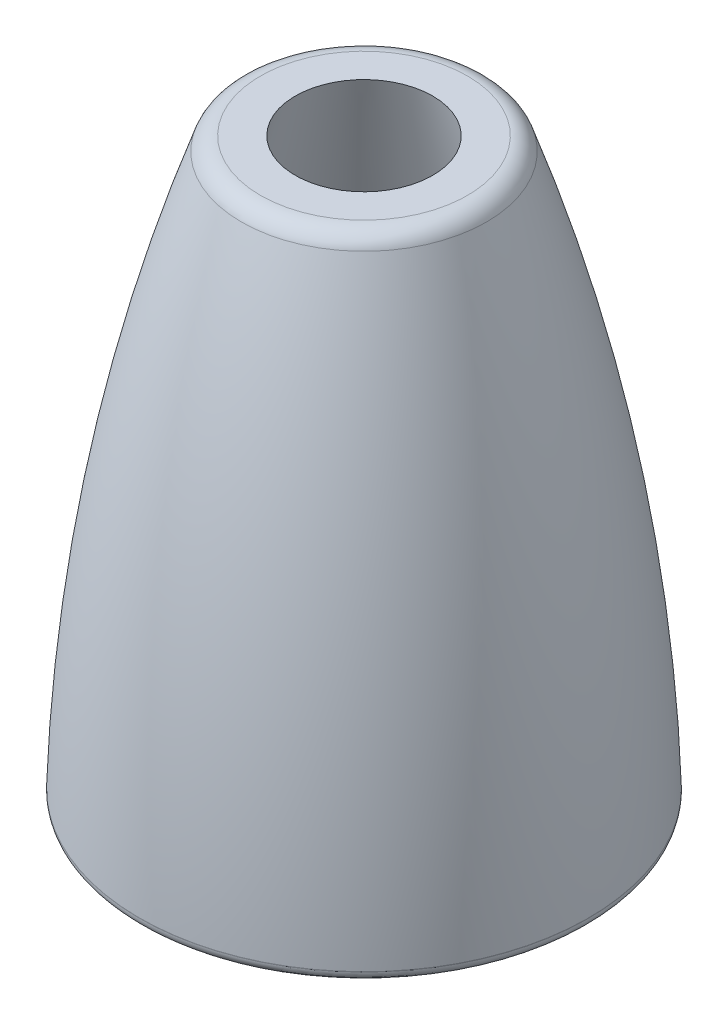
ISO-10303-21;
HEADER;
FILE_DESCRIPTION(('STEP AP214'),'2;1');
FILE_NAME('part.step','',(''),(''),'','','');
FILE_SCHEMA(('AUTOMOTIVE_DESIGN { 1 0 10303 214 1 1 1 1 }'));
ENDSEC;
DATA;
#1=APPLICATION_CONTEXT('core data for automotive mechanical design processes');
#2=APPLICATION_PROTOCOL_DEFINITION('international standard','automotive_design',2000,#1);
#3=PRODUCT_CONTEXT('',#1,'mechanical');
#4=PRODUCT('Part','Part','',(#3));
#5=PRODUCT_RELATED_PRODUCT_CATEGORY('part','',(#4));
#6=PRODUCT_DEFINITION_FORMATION('','',#4);
#7=PRODUCT_DEFINITION_CONTEXT('part definition',#1,'design');
#8=PRODUCT_DEFINITION('design','',#6,#7);
#9=PRODUCT_DEFINITION_SHAPE('','',#8);
#10=(LENGTH_UNIT() NAMED_UNIT(*) SI_UNIT(.MILLI.,.METRE.));
#11=(NAMED_UNIT(*) PLANE_ANGLE_UNIT() SI_UNIT($,.RADIAN.));
#12=(NAMED_UNIT(*) SI_UNIT($,.STERADIAN.) SOLID_ANGLE_UNIT());
#13=UNCERTAINTY_MEASURE_WITH_UNIT(LENGTH_MEASURE(1.E-05),#10,'distance_accuracy_value','');
#14=(GEOMETRIC_REPRESENTATION_CONTEXT(3) GLOBAL_UNCERTAINTY_ASSIGNED_CONTEXT((#13)) GLOBAL_UNIT_ASSIGNED_CONTEXT((#10,
#11,#12)) REPRESENTATION_CONTEXT('',''));
#15=CARTESIAN_POINT('',(0.,0.,0.));
#16=DIRECTION('',(0.,0.,1.));
#17=DIRECTION('',(1.,0.,0.));
#18=AXIS2_PLACEMENT_3D('',#15,#16,#17);
#19=CARTESIAN_POINT('',(0.,25.0000000000341,0.));
#20=DIRECTION('',(0.,-1.,0.));
#21=DIRECTION('',(0.,0.,-1.));
#22=AXIS2_PLACEMENT_3D('',#19,#20,#21);
#23=CYLINDRICAL_SURFACE('',#22,5.025);
#24=CARTESIAN_POINT('',(0.,24.,0.));
#25=DIRECTION('',(0.,-1.,0.));
#26=DIRECTION('',(0.,0.,-1.));
#27=AXIS2_PLACEMENT_3D('',#24,#25,#26);
#28=CIRCLE('',#27,5.025);
#29=CARTESIAN_POINT('',(0.,24.,-5.025));
#30=VERTEX_POINT('',#29);
#31=EDGE_CURVE('E22',#30,#30,#28,.F.);
#32=ORIENTED_EDGE('',*,*,#31,.F.);
#33=EDGE_LOOP('',(#32));
#34=FACE_BOUND('',#33,.T.);
#35=CARTESIAN_POINT('',(0.,25.0000000000346,0.));
#36=DIRECTION('',(0.,-1.,0.));
#37=DIRECTION('',(0.,0.,-1.));
#38=AXIS2_PLACEMENT_3D('',#35,#36,#37);
#39=CIRCLE('',#38,5.0249999999911);
#40=CARTESIAN_POINT('',(0.,25.0000000000346,-5.0249999999911));
#41=VERTEX_POINT('',#40);
#42=EDGE_CURVE('E138',#41,#41,#39,.T.);
#43=ORIENTED_EDGE('',*,*,#42,.F.);
#44=EDGE_LOOP('',(#43));
#45=FACE_BOUND('',#44,.T.);
#46=ADVANCED_FACE('F17',(#34,#45),#23,.F.);
#47=CARTESIAN_POINT('',(-5.1255,24.,-5.025));
#48=DIRECTION('',(0.,1.,0.));
#49=DIRECTION('',(0.,0.,1.));
#50=AXIS2_PLACEMENT_3D('',#47,#48,#49);
#51=PLANE('',#50);
#52=CARTESIAN_POINT('',(0.,24.,0.));
#53=DIRECTION('',(0.,-1.,0.));
#54=DIRECTION('',(0.,0.,-1.));
#55=AXIS2_PLACEMENT_3D('',#52,#53,#54);
#56=CIRCLE('',#55,3.525);
#57=CARTESIAN_POINT('',(0.,24.,-3.525));
#58=VERTEX_POINT('',#57);
#59=EDGE_CURVE('E136',#58,#58,#56,.F.);
#60=ORIENTED_EDGE('',*,*,#59,.F.);
#61=EDGE_LOOP('',(#60));
#62=FACE_BOUND('',#61,.T.);
#63=ORIENTED_EDGE('',*,*,#31,.T.);
#64=EDGE_LOOP('',(#63));
#65=FACE_BOUND('',#64,.T.);
#66=ADVANCED_FACE('F212',(#62,#65),#51,.T.);
#67=CARTESIAN_POINT('',(0.,30.9999999999491,0.));
#68=DIRECTION('',(0.,-1.,0.));
#69=DIRECTION('',(0.,0.,-1.));
#70=AXIS2_PLACEMENT_3D('',#67,#68,#69);
#71=CONICAL_SURFACE('',#70,3.41616039207793,0.261977344229932);
#72=ORIENTED_EDGE('',*,*,#42,.T.);
#73=EDGE_LOOP('',(#72));
#74=FACE_BOUND('',#73,.T.);
#75=CARTESIAN_POINT('',(0.,30.9999999999966,0.));
#76=DIRECTION('',(0.,-1.,0.));
#77=DIRECTION('',(0.,0.,-1.));
#78=AXIS2_PLACEMENT_3D('',#75,#76,#77);
#79=CIRCLE('',#78,3.4161603920652);
#80=CARTESIAN_POINT('',(0.,30.9999999999966,-3.4161603920652));
#81=VERTEX_POINT('',#80);
#82=EDGE_CURVE('E134',#81,#81,#79,.T.);
#83=ORIENTED_EDGE('',*,*,#82,.F.);
#84=EDGE_LOOP('',(#83));
#85=FACE_BOUND('',#84,.T.);
#86=ADVANCED_FACE('F206',(#74,#85),#71,.F.);
#87=CARTESIAN_POINT('',(0.,24.,0.));
#88=DIRECTION('',(0.,-1.,0.));
#89=DIRECTION('',(0.,0.,-1.));
#90=AXIS2_PLACEMENT_3D('',#87,#88,#89);
#91=CYLINDRICAL_SURFACE('',#90,3.525);
#92=CARTESIAN_POINT('',(0.,15.2,0.));
#93=DIRECTION('',(0.,-1.,0.));
#94=DIRECTION('',(0.,0.,-1.));
#95=AXIS2_PLACEMENT_3D('',#92,#93,#94);
#96=CIRCLE('',#95,3.525);
#97=CARTESIAN_POINT('',(0.,15.2,-3.525));
#98=VERTEX_POINT('',#97);
#99=EDGE_CURVE('E67',#98,#98,#96,.F.);
#100=ORIENTED_EDGE('',*,*,#99,.F.);
#101=EDGE_LOOP('',(#100));
#102=FACE_BOUND('',#101,.T.);
#103=ORIENTED_EDGE('',*,*,#59,.T.);
#104=EDGE_LOOP('',(#103));
#105=FACE_BOUND('',#104,.T.);
#106=ADVANCED_FACE('F198',(#102,#105),#91,.F.);
#107=CARTESIAN_POINT('',(-5.142709066435,31.,-5.142709066435));
#108=DIRECTION('',(0.,1.,0.));
#109=DIRECTION('',(0.,0.,1.));
#110=AXIS2_PLACEMENT_3D('',#107,#108,#109);
#111=PLANE('',#110);
#112=ORIENTED_EDGE('',*,*,#82,.T.);
#113=EDGE_LOOP('',(#112));
#114=FACE_BOUND('',#113,.T.);
#115=CARTESIAN_POINT('',(0.,31.,0.));
#116=DIRECTION('',(0.,1.,0.));
#117=DIRECTION('',(0.,0.,1.));
#118=AXIS2_PLACEMENT_3D('',#115,#116,#117);
#119=CIRCLE('',#118,5.14270906643498);
#120=CARTESIAN_POINT('',(0.,31.,5.14270906643496));
#121=VERTEX_POINT('',#120);
#122=EDGE_CURVE('E63',#121,#121,#119,.F.);
#123=ORIENTED_EDGE('',*,*,#122,.F.);
#124=EDGE_LOOP('',(#123));
#125=FACE_BOUND('',#124,.T.);
#126=ADVANCED_FACE('F196',(#114,#125),#111,.T.);
#127=CARTESIAN_POINT('',(-5.6,15.2,5.71204961205923));
#128=DIRECTION('',(0.,-1.,0.));
#129=DIRECTION('',(0.,0.,-1.));
#130=AXIS2_PLACEMENT_3D('',#127,#128,#129);
#131=PLANE('',#130);
#132=ORIENTED_EDGE('',*,*,#99,.T.);
#133=EDGE_LOOP('',(#132));
#134=FACE_BOUND('',#133,.T.);
#135=CARTESIAN_POINT('',(0.,15.1999999999009,5.6000199105327));
#136=CARTESIAN_POINT('',(0.0905630030758775,15.199999999903,5.60002155790611));
#137=CARTESIAN_POINT('',(0.181125845155238,15.199999999905,5.59782270126528));
#138=CARTESIAN_POINT('',(0.362038470237308,15.199999999909,5.58903729808633));
#139=CARTESIAN_POINT('',(0.452388253263688,15.199999999911,5.58245075203571));
#140=CARTESIAN_POINT('',(0.63266203336029,15.1999999999148,5.56490328913766));
#141=CARTESIAN_POINT('',(0.722586030477821,15.1999999999167,5.55394237277625));
#142=CARTESIAN_POINT('',(0.901796648253183,15.1999999999205,5.52767254933547));
#143=CARTESIAN_POINT('',(0.991083268981831,15.1999999999223,5.5123636427392));
#144=CARTESIAN_POINT('',(1.16880900747506,15.1999999999259,5.47743370972359));
#145=CARTESIAN_POINT('',(1.25724812533381,15.1999999999277,5.45781268378336));
#146=CARTESIAN_POINT('',(1.43307073570994,15.1999999999312,5.41430472936011));
#147=CARTESIAN_POINT('',(1.52045422834461,15.1999999999329,5.39041780135107));
#148=CARTESIAN_POINT('',(1.69395994757016,15.1999999999363,5.33843424582134));
#149=CARTESIAN_POINT('',(1.78008217430118,15.1999999999379,5.31033761876839));
#150=CARTESIAN_POINT('',(1.95086268990397,15.1999999999411,5.25000078915556));
#151=CARTESIAN_POINT('',(2.03552097893839,15.1999999999427,5.21776058705607));
#152=CARTESIAN_POINT('',(2.2031743922903,15.1999999999458,5.14921247863265));
#153=CARTESIAN_POINT('',(2.28616951679258,15.1999999999473,5.11290457276067));
#154=CARTESIAN_POINT('',(2.45030128825717,15.1999999999503,5.03630650164722));
#155=CARTESIAN_POINT('',(2.53143793542597,15.1999999999517,4.9960163368482));
#156=CARTESIAN_POINT('',(2.69166181300274,15.1999999999546,4.91154856392943));
#157=CARTESIAN_POINT('',(2.77074904363841,15.199999999956,4.86737095624162));
#158=CARTESIAN_POINT('',(2.92668797188519,15.1999999999587,4.7752322620022));
#159=CARTESIAN_POINT('',(3.00353966974467,15.19999999996,4.72727117587099));
#160=CARTESIAN_POINT('',(3.15482667711589,15.1999999999626,4.62767839285415));
#161=CARTESIAN_POINT('',(3.22926198689612,15.1999999999638,4.57604669637637));
#162=CARTESIAN_POINT('',(3.37554104933481,15.1999999999663,4.46923419883766));
#163=CARTESIAN_POINT('',(3.44738480228121,15.1999999999675,4.41405339817106));
#164=CARTESIAN_POINT('',(3.58831168105205,15.1999999999698,4.30027255053765));
#165=CARTESIAN_POINT('',(3.65739480718319,15.1999999999709,4.24167250395075));
#166=CARTESIAN_POINT('',(3.79263785896979,15.1999999999731,4.1211910692746));
#167=CARTESIAN_POINT('',(3.85879778495003,15.1999999999742,4.05930968154994));
#168=CARTESIAN_POINT('',(3.98803874231148,15.1999999999763,3.93241119137621));
#169=CARTESIAN_POINT('',(4.05111977403478,15.1999999999773,3.86739408927555));
#170=CARTESIAN_POINT('',(4.1740544943843,15.1999999999792,3.73437717640142));
#171=CARTESIAN_POINT('',(4.2339081833691,15.1999999999801,3.66637736595934));
#172=CARTESIAN_POINT('',(4.35024736471235,15.1999999999819,3.5275550616554));
#173=CARTESIAN_POINT('',(4.40673285744503,15.1999999999828,3.45673256810716));
#174=CARTESIAN_POINT('',(4.51620271919417,15.1999999999845,3.31243156545494));
#175=CARTESIAN_POINT('',(4.56918708859964,15.1999999999853,3.23895305664607));
#176=CARTESIAN_POINT('',(4.67153001585892,15.1999999999868,3.08951294172508));
#177=CARTESIAN_POINT('',(4.72088857411559,15.1999999999876,3.01355133588886));
#178=CARTESIAN_POINT('',(4.81586372393013,15.199999999989,2.85932378862306));
#179=CARTESIAN_POINT('',(4.86148031590376,15.1999999999897,2.78105784744953));
#180=CARTESIAN_POINT('',(4.94886418401547,15.199999999991,2.62240581399186));
#181=CARTESIAN_POINT('',(4.99063146058123,15.1999999999916,2.5420197219433));
#182=CARTESIAN_POINT('',(5.07021840746773,15.1999999999927,2.37931656055324));
#183=CARTESIAN_POINT('',(5.10803807822707,15.1999999999933,2.29699949142628));
#184=CARTESIAN_POINT('',(5.17964081277668,15.1999999999943,2.13062809382312));
#185=CARTESIAN_POINT('',(5.21342387701544,15.1999999999948,2.04657376553994));
#186=CARTESIAN_POINT('',(5.27687389822641,15.1999999999957,1.87692565590165));
#187=CARTESIAN_POINT('',(5.30654085565594,15.1999999999961,1.79133187471759));
#188=CARTESIAN_POINT('',(5.36168884562387,15.1999999999969,1.61880628806438));
#189=CARTESIAN_POINT('',(5.38716987862736,15.1999999999973,1.5318744827439));
#190=CARTESIAN_POINT('',(5.43388606715607,15.1999999999979,1.35687742629796));
#191=CARTESIAN_POINT('',(5.45512122315304,15.1999999999982,1.26881217529845));
#192=CARTESIAN_POINT('',(5.49329564378723,15.1999999999987,1.0917554697196));
#193=CARTESIAN_POINT('',(5.51023490890175,15.1999999999989,1.00276401524318));
#194=CARTESIAN_POINT('',(5.53977784189312,15.1999999999993,0.824064337810933));
#195=CARTESIAN_POINT('',(5.55238151025169,15.1999999999995,0.734356114934741));
#196=CARTESIAN_POINT('',(5.57322300630336,15.1999999999997,0.554433972980454));
#197=CARTESIAN_POINT('',(5.58146083448153,15.1999999999998,0.464220053958547));
#198=CARTESIAN_POINT('',(5.59355344472772,15.2,0.283498966941439));
#199=CARTESIAN_POINT('',(5.59740822728273,15.2,0.192991798978821));
#200=CARTESIAN_POINT('',(5.59906288415797,15.2,0.102444225042774));
#201=B_SPLINE_CURVE_WITH_KNOTS('',3,(#135,#136,#137,#138,#139,#140,#141,#142,#143,#144,#145,
#146,#147,#148,#149,#150,#151,#152,#153,#154,#155,#156,#157,#158,#159,#160,#161,#162,#163,#164,
#165,#166,#167,#168,#169,#170,#171,#172,#173,#174,#175,#176,#177,#178,#179,#180,#181,#182,#183,
#184,#185,#186,#187,#188,#189,#190,#191,#192,#193,#194,#195,#196,#197,#198,#199,#200),
.UNSPECIFIED.,.F.,.F.,(4,2,2,2,2,2,2,2,2,2,2,2,2,2,2,2,2,2,2,2,2,2,2,2,2,2,2,2,2,2,2,2,4),(0.,
0.271662102687851,0.543324175192006,0.814986217512464,1.08664822964923,1.3583102116023,
1.62997216337167,1.90163408495735,2.17329597635933,2.44495783757762,2.71661966861221,
2.9882814694631,3.2599432401303,3.5316049806138,3.80326669091361,4.07492837102972,
4.34659002096214,4.61825164071086,4.88991323027588,5.16157478965721,5.43323631885485,
5.70489781786879,5.97655928669903,6.24822072534557,6.51988213380843,6.79154351208758,
7.06320486018304,7.33486617809481,7.60652746582288,7.87818872336725,8.14984995072793,
8.42151114790491,8.6931723148982),.UNSPECIFIED.);
#202=CARTESIAN_POINT('',(0.,15.1999999999009,5.6000199105327));
#203=VERTEX_POINT('',#202);
#204=CARTESIAN_POINT('',(5.59906288415796,15.2,0.102444225042774));
#205=VERTEX_POINT('',#204);
#206=EDGE_CURVE('E53',#203,#205,#201,.T.);
#207=ORIENTED_EDGE('',*,*,#206,.F.);
#208=CARTESIAN_POINT('',(-5.6,15.2,0.));
#209=CARTESIAN_POINT('',(-5.60000215109812,15.2,0.0916298833601626));
#210=CARTESIAN_POINT('',(-5.59775155045365,15.2,0.183259606403878));
#211=CARTESIAN_POINT('',(-5.58875880145404,15.1999999999998,0.36629841729192));
#212=CARTESIAN_POINT('',(-5.58201665259985,15.1999999999997,0.457707505111731));
#213=CARTESIAN_POINT('',(-5.56405476196315,15.1999999999995,0.640084720657766));
#214=CARTESIAN_POINT('',(-5.55283501968315,15.1999999999993,0.731052848334995));
#215=CARTESIAN_POINT('',(-5.52594558324695,15.1999999999989,0.912329023413482));
#216=CARTESIAN_POINT('',(-5.51027588859632,15.1999999999987,1.0026370707414));
#217=CARTESIAN_POINT('',(-5.47452413192306,15.1999999999982,1.18237551691243));
#218=CARTESIAN_POINT('',(-5.45444206941017,15.1999999999979,1.27180591565803));
#219=CARTESIAN_POINT('',(-5.40991399946971,15.1999999999973,1.44957362096694));
#220=CARTESIAN_POINT('',(-5.38546799155727,15.1999999999969,1.53791092740879));
#221=CARTESIAN_POINT('',(-5.33227091063511,15.1999999999961,1.71327963497953));
#222=CARTESIAN_POINT('',(-5.30351983714706,15.1999999999957,1.80031103596332));
#223=CARTESIAN_POINT('',(-5.2417818911297,15.1999999999948,1.97285826621488));
#224=CARTESIAN_POINT('',(-5.20879501812977,15.1999999999943,2.05837409531426));
#225=CARTESIAN_POINT('',(-5.13866493956747,15.1999999999933,2.22768416629604));
#226=CARTESIAN_POINT('',(-5.10152173354331,15.1999999999927,2.31147840798716));
#227=CARTESIAN_POINT('',(-5.0231684694724,15.1999999999916,2.47714343611324));
#228=CARTESIAN_POINT('',(-4.98195841097379,15.199999999991,2.5590142223345));
#229=CARTESIAN_POINT('',(-4.89557071962999,15.1999999999897,2.7206351051954));
#230=CARTESIAN_POINT('',(-4.85039308634398,15.199999999989,2.80038520159943));
#231=CARTESIAN_POINT('',(-4.75617908143569,15.1999999999876,2.9575725793879));
#232=CARTESIAN_POINT('',(-4.70714270938467,15.1999999999868,3.03500986051537));
#233=CARTESIAN_POINT('',(-4.6053293589999,15.1999999999853,3.18738505404364));
#234=CARTESIAN_POINT('',(-4.55255238025053,15.1999999999845,3.26232296616673));
#235=CARTESIAN_POINT('',(-4.44338496000351,15.1999999999828,3.40951888913681));
#236=CARTESIAN_POINT('',(-4.38699451810439,15.1999999999819,3.48177689968603));
#237=CARTESIAN_POINT('',(-4.27073602026834,15.1999999999801,3.62343894303635));
#238=CARTESIAN_POINT('',(-4.21086796394503,15.1999999999792,3.69284297552035));
#239=CARTESIAN_POINT('',(-4.08779846387943,15.1999999999773,3.82862986171271));
#240=CARTESIAN_POINT('',(-4.02459701976677,15.1999999999763,3.89501271508539));
#241=CARTESIAN_POINT('',(-3.89501300119638,15.1999999999742,4.02459732027553));
#242=CARTESIAN_POINT('',(-3.8286304263852,15.1999999999731,4.08779907173953));
#243=CARTESIAN_POINT('',(-3.69284406714803,15.1999999999709,4.21086921385034));
#244=CARTESIAN_POINT('',(-3.62344028238636,15.1999999999698,4.27073760412679));
#245=CARTESIAN_POINT('',(-3.4817787023734,15.1999999999675,4.38699679492564));
#246=CARTESIAN_POINT('',(-3.409520906805,15.1999999999663,4.44338759506166));
#247=CARTESIAN_POINT('',(-3.26232537990294,15.1999999999638,4.55255575443042));
#248=CARTESIAN_POINT('',(-3.18738764827153,15.1999999999626,4.60533311326168));
#249=CARTESIAN_POINT('',(-3.03501278020714,15.19999999996,4.70714724393661));
#250=CARTESIAN_POINT('',(-2.95757564349646,15.1999999999587,4.75618401536467));
#251=CARTESIAN_POINT('',(-2.80038851756338,15.199999999956,4.85039883652887));
#252=CARTESIAN_POINT('',(-2.72063852808401,15.1999999999546,4.89557688583627));
#253=CARTESIAN_POINT('',(-2.55901782080873,15.1999999999517,4.98196542400749));
#254=CARTESIAN_POINT('',(-2.47714710277719,15.1999999999503,5.02317591243048));
#255=CARTESIAN_POINT('',(-2.31148217166007,15.1999999999473,5.10153004833574));
#256=CARTESIAN_POINT('',(-2.22768795836077,15.1999999999458,5.13867369536617));
#257=CARTESIAN_POINT('',(-2.05837790386892,15.1999999999427,5.20880466505674));
#258=CARTESIAN_POINT('',(-1.97286206248508,15.1999999999411,5.24179198725508));
#259=CARTESIAN_POINT('',(-1.80031476663533,15.1999999999379,5.30353083785566));
#260=CARTESIAN_POINT('',(-1.71328331200104,15.1999999999363,5.33228236578725));
#261=CARTESIAN_POINT('',(-1.53791445555571,15.1999999999329,5.38548035880558));
#262=CARTESIAN_POINT('',(-1.44957705359959,15.1999999999312,5.40992682341398));
#263=CARTESIAN_POINT('',(-1.27180911533818,15.1999999999277,5.45445580694195));
#264=CARTESIAN_POINT('',(-1.18237857891145,15.1999999999259,5.47453832537665));
#265=CARTESIAN_POINT('',(-1.00263981530045,15.1999999999223,5.51029099105116));
#266=CARTESIAN_POINT('',(-0.912331588018666,15.1999999999205,5.52596113780073));
#267=CARTESIAN_POINT('',(-0.731055010996757,15.1999999999167,5.55285147254281));
#268=CARTESIAN_POINT('',(-0.640086661183286,15.1999999999148,5.56407166004091));
#269=CARTESIAN_POINT('',(-0.4577089595763,15.199999999911,5.58203443216942));
#270=CARTESIAN_POINT('',(-0.366299607733787,15.199999999909,5.58877701630234));
#271=CARTESIAN_POINT('',(-0.183260227431621,15.199999999905,5.59777062388505));
#272=CARTESIAN_POINT('',(-0.0916301989474497,15.199999999903,5.6000216468358));
#273=CARTESIAN_POINT('',(0.,15.1999999999009,5.6000199105327));
#274=B_SPLINE_CURVE_WITH_KNOTS('',3,(#208,#209,#210,#211,#212,#213,#214,#215,#216,#217,#218,
#219,#220,#221,#222,#223,#224,#225,#226,#227,#228,#229,#230,#231,#232,#233,#234,#235,#236,#237,
#238,#239,#240,#241,#242,#243,#244,#245,#246,#247,#248,#249,#250,#251,#252,#253,#254,#255,#256,
#257,#258,#259,#260,#261,#262,#263,#264,#265,#266,#267,#268,#269,#270,#271,#272,#273),
.UNSPECIFIED.,.F.,.F.,(4,2,2,2,2,2,2,2,2,2,2,2,2,2,2,2,2,2,2,2,2,2,2,2,2,2,2,2,2,2,2,2,4),(0.,
0.274861774726979,0.549723579993257,0.824585415798854,1.09944728214375,1.37430917902796,
1.64917110645148,1.9240330644143,2.19889505291644,2.47375707195788,2.74861912153863,
3.02348120165869,3.29834331231806,3.57320545351673,3.84806762525472,4.12292982753201,
4.39779206034861,4.67265432370452,4.94751661759973,5.22237894203426,5.4972412970081,
5.77210368252124,6.04696609857369,6.32182854516545,6.59669102229652,6.87155352996689,
7.14641606817657,7.42127863692557,7.69614123621387,7.97100386604148,8.2458665264084,
8.52072921731462,8.79559193876016),.UNSPECIFIED.);
#275=CARTESIAN_POINT('',(-5.6,15.2,0.));
#276=VERTEX_POINT('',#275);
#277=EDGE_CURVE('E59',#276,#203,#274,.T.);
#278=ORIENTED_EDGE('',*,*,#277,.F.);
#279=CARTESIAN_POINT('',(0.,15.2,0.));
#280=DIRECTION('',(0.,-1.,0.));
#281=DIRECTION('',(0.,0.,-1.));
#282=AXIS2_PLACEMENT_3D('',#279,#280,#281);
#283=CIRCLE('',#282,5.60000000000007);
#284=EDGE_CURVE('E57',#205,#276,#283,.F.);
#285=ORIENTED_EDGE('',*,*,#284,.F.);
#286=EDGE_LOOP('',(#207,#278,#285));
#287=FACE_BOUND('',#286,.T.);
#288=ADVANCED_FACE('F62',(#134,#287),#131,.T.);
#289=CARTESIAN_POINT('',(0.,30.0000000000001,0.));
#290=DIRECTION('',(0.,1.,0.));
#291=DIRECTION('',(0.,0.,1.));
#292=AXIS2_PLACEMENT_3D('',#289,#290,#291);
#293=TOROIDAL_SURFACE('',#292,5.14270906643512,0.999999999999914);
#294=CARTESIAN_POINT('',(0.,30.3278362805497,-3.97338412172488E-12));
#295=DIRECTION('',(0.,-1.,0.));
#296=DIRECTION('',(0.,0.,-1.));
#297=AXIS2_PLACEMENT_3D('',#294,#295,#296);
#298=CIRCLE('',#297,6.08744361812101);
#299=CARTESIAN_POINT('',(0.,30.3278362805497,-6.08744361812499));
#300=VERTEX_POINT('',#299);
#301=EDGE_CURVE('E60',#300,#300,#298,.T.);
#302=ORIENTED_EDGE('',*,*,#301,.F.);
#303=EDGE_LOOP('',(#302));
#304=FACE_BOUND('',#303,.T.);
#305=ORIENTED_EDGE('',*,*,#122,.T.);
#306=EDGE_LOOP('',(#305));
#307=FACE_BOUND('',#306,.T.);
#308=ADVANCED_FACE('F85',(#304,#307),#293,.T.);
#309=CARTESIAN_POINT('',(0.,13.2,0.));
#310=DIRECTION('',(0.,-1.,0.));
#311=DIRECTION('',(0.,0.,-1.));
#312=AXIS2_PLACEMENT_3D('',#309,#310,#311);
#313=TOROIDAL_SURFACE('',#312,5.60000000000002,1.99999999999998);
#314=CARTESIAN_POINT('',(0.,13.2,0.));
#315=DIRECTION('',(0.,1.,0.));
#316=DIRECTION('',(0.,0.,1.));
#317=AXIS2_PLACEMENT_3D('',#314,#315,#316);
#318=CIRCLE('',#317,7.6);
#319=CARTESIAN_POINT('',(0.,13.2,7.6));
#320=VERTEX_POINT('',#319);
#321=EDGE_CURVE('E152',#320,#320,#318,.T.);
#322=ORIENTED_EDGE('',*,*,#321,.F.);
#323=EDGE_LOOP('',(#322));
#324=FACE_BOUND('',#323,.T.);
#325=ORIENTED_EDGE('',*,*,#206,.T.);
#326=ORIENTED_EDGE('',*,*,#284,.T.);
#327=ORIENTED_EDGE('',*,*,#277,.T.);
#328=EDGE_LOOP('',(#325,#326,#327));
#329=FACE_BOUND('',#328,.T.);
#330=ADVANCED_FACE('F58',(#324,#329),#313,.F.);
#331=CARTESIAN_POINT('',(0.,-5.41001705239852E-11,-3.96904731303493E-12));
#332=DIRECTION('',(0.,1.,0.));
#333=DIRECTION('',(0.,0.,1.));
#334=AXIS2_PLACEMENT_3D('',#331,#332,#333);
#335=DEGENERATE_TOROIDAL_SURFACE('',#334,81.3090909092601,92.509090909266,.F.);
#336=CARTESIAN_POINT('',(1.28363032009249E-11,2.91575931300689,-1.22079097861476E-10));
#337=DIRECTION('',(-6.75518594424117E-11,-1.,5.65070499147971E-10));
#338=DIRECTION('',(0.,-5.65070499147971E-10,-1.));
#339=AXIS2_PLACEMENT_3D('',#336,#337,#338);
#340=CIRCLE('',#339,11.1540382205759);
#341=CARTESIAN_POINT('',(11.1534150442628,2.91575930857768,0.117904536256761));
#342=VERTEX_POINT('',#341);
#343=CARTESIAN_POINT('',(-11.1534150441237,2.91575931277776,-0.117904536250829));
#344=VERTEX_POINT('',#343);
#345=EDGE_CURVE('E148',#342,#344,#340,.T.);
#346=ORIENTED_EDGE('',*,*,#345,.F.);
#347=CARTESIAN_POINT('',(-1.28363032009249E-11,2.91575931300662,1.22079097861476E-10));
#348=DIRECTION('',(6.75538186796917E-11,-1.,-5.65082959955305E-10));
#349=DIRECTION('',(0.,5.65082959955305E-10,-1.));
#350=AXIS2_PLACEMENT_3D('',#347,#348,#349);
#351=CIRCLE('',#350,11.1540382205759);
#352=EDGE_CURVE('E130',#344,#342,#351,.T.);
#353=ORIENTED_EDGE('',*,*,#352,.F.);
#354=EDGE_LOOP('',(#346,#353));
#355=FACE_BOUND('',#354,.T.);
#356=ORIENTED_EDGE('',*,*,#301,.T.);
#357=EDGE_LOOP('',(#356));
#358=FACE_BOUND('',#357,.T.);
#359=ADVANCED_FACE('F84',(#355,#358),#335,.F.);
#360=CARTESIAN_POINT('',(0.,13.2,0.));
#361=DIRECTION('',(0.,-1.,0.));
#362=DIRECTION('',(0.,0.,-1.));
#363=AXIS2_PLACEMENT_3D('',#360,#361,#362);
#364=CYLINDRICAL_SURFACE('',#363,7.6);
#365=CARTESIAN_POINT('',(0.,2.4,0.));
#366=DIRECTION('',(0.,-1.,0.));
#367=DIRECTION('',(0.,0.,-1.));
#368=AXIS2_PLACEMENT_3D('',#365,#366,#367);
#369=CIRCLE('',#368,7.6);
#370=CARTESIAN_POINT('',(0.,2.4,-7.6));
#371=VERTEX_POINT('',#370);
#372=EDGE_CURVE('E113',#371,#371,#369,.F.);
#373=ORIENTED_EDGE('',*,*,#372,.F.);
#374=EDGE_LOOP('',(#373));
#375=FACE_BOUND('',#374,.T.);
#376=ORIENTED_EDGE('',*,*,#321,.T.);
#377=EDGE_LOOP('',(#376));
#378=FACE_BOUND('',#377,.T.);
#379=ADVANCED_FACE('F91',(#375,#378),#364,.F.);
#380=CARTESIAN_POINT('',(1.17718335079786E-11,2.89999999585906,-1.13173969436449E-10));
#381=DIRECTION('',(6.75518594424117E-11,1.,-5.65070499147971E-10));
#382=DIRECTION('',(0.,5.65070499147971E-10,1.));
#383=AXIS2_PLACEMENT_3D('',#380,#381,#382);
#384=TOROIDAL_SURFACE('',#383,10.6542865616283,0.500000076697844);
#385=CARTESIAN_POINT('',(-10.6536913065035,2.8999999952045,-0.112621876605089));
#386=DIRECTION('',(0.0105705695111124,5.6580442423694E-10,-0.999944129969375));
#387=DIRECTION('',(-0.999944129969375,0.,-0.0105705695111124));
#388=AXIS2_PLACEMENT_3D('',#385,#386,#387);
#389=CIRCLE('',#388,0.50000007651756);
#390=CARTESIAN_POINT('',(-11.1536634479504,2.9,-0.117907162168941));
#391=VERTEX_POINT('',#390);
#392=EDGE_CURVE('E157',#391,#344,#389,.T.);
#393=ORIENTED_EDGE('',*,*,#392,.F.);
#394=CARTESIAN_POINT('',(0.,2.9,0.));
#395=DIRECTION('',(0.,-1.,0.));
#396=DIRECTION('',(0.,0.,-1.));
#397=AXIS2_PLACEMENT_3D('',#394,#395,#396);
#398=CIRCLE('',#397,11.15428663826);
#399=CARTESIAN_POINT('',(11.1536634479434,2.89999999809481,0.117907162168872));
#400=VERTEX_POINT('',#399);
#401=EDGE_CURVE('E116',#400,#391,#398,.T.);
#402=ORIENTED_EDGE('',*,*,#401,.F.);
#403=CARTESIAN_POINT('',(10.6536913062659,2.89999999651428,0.112621876613167));
#404=DIRECTION('',(0.0105705694899437,5.65710168598072E-10,-0.999944129969599));
#405=DIRECTION('',(-0.999944129969599,0.,-0.0105705694899437));
#406=AXIS2_PLACEMENT_3D('',#403,#404,#405);
#407=CIRCLE('',#406,0.500000076733939);
#408=EDGE_CURVE('E151',#342,#400,#407,.T.);
#409=ORIENTED_EDGE('',*,*,#408,.F.);
#410=ORIENTED_EDGE('',*,*,#345,.T.);
#411=EDGE_LOOP('',(#393,#402,#409,#410));
#412=FACE_BOUND('',#411,.T.);
#413=ADVANCED_FACE('F95',(#412),#384,.T.);
#414=CARTESIAN_POINT('',(-1.17718335079786E-11,2.89999999585822,1.13173779701069E-10));
#415=DIRECTION('',(-6.75538186796917E-11,1.,5.65082959955305E-10));
#416=DIRECTION('',(0.,-5.65082959955305E-10,1.));
#417=AXIS2_PLACEMENT_3D('',#414,#415,#416);
#418=TOROIDAL_SURFACE('',#417,10.6542865615922,0.500000076733939);
#419=ORIENTED_EDGE('',*,*,#392,.T.);
#420=ORIENTED_EDGE('',*,*,#352,.T.);
#421=ORIENTED_EDGE('',*,*,#408,.T.);
#422=CARTESIAN_POINT('',(0.,2.9,0.));
#423=DIRECTION('',(0.,-1.,0.));
#424=DIRECTION('',(0.,0.,-1.));
#425=AXIS2_PLACEMENT_3D('',#422,#423,#424);
#426=CIRCLE('',#425,11.15428663826);
#427=EDGE_CURVE('E120',#391,#400,#426,.T.);
#428=ORIENTED_EDGE('',*,*,#427,.F.);
#429=EDGE_LOOP('',(#419,#420,#421,#428));
#430=FACE_BOUND('',#429,.T.);
#431=ADVANCED_FACE('F99',(#430),#418,.T.);
#432=CARTESIAN_POINT('',(-10.65428663826,2.4,10.710152703346));
#433=DIRECTION('',(0.,-1.,0.));
#434=DIRECTION('',(0.,0.,-1.));
#435=AXIS2_PLACEMENT_3D('',#432,#433,#434);
#436=PLANE('',#435);
#437=ORIENTED_EDGE('',*,*,#372,.T.);
#438=EDGE_LOOP('',(#437));
#439=FACE_BOUND('',#438,.T.);
#440=CARTESIAN_POINT('',(10.65428663826,2.39999999999993,0.));
#441=CARTESIAN_POINT('',(10.6542905931412,2.39999999999993,-0.174330539819944));
#442=CARTESIAN_POINT('',(10.6500085726895,2.40000000000012,-0.348660771261587));
#443=CARTESIAN_POINT('',(10.6328991330285,2.40000000000092,-0.69690145088031));
#444=CARTESIAN_POINT('',(10.6200717132009,2.40000000000151,-0.870811899027022));
#445=CARTESIAN_POINT('',(10.5858980254673,2.40000000000309,-1.21779383275543));
#446=CARTESIAN_POINT('',(10.564551756945,2.40000000000408,-1.39086531827644));
#447=CARTESIAN_POINT('',(10.5133929613229,2.40000000000646,-1.73575243953494));
#448=CARTESIAN_POINT('',(10.4835804336107,2.40000000000785,-1.90756807518158));
#449=CARTESIAN_POINT('',(10.4155606270254,2.40000000001101,-2.24952956224845));
#450=CARTESIAN_POINT('',(10.377353347545,2.4000000000128,-2.41967541354789));
#451=CARTESIAN_POINT('',(10.2926361645853,2.40000000001676,-2.75788743953184));
#452=CARTESIAN_POINT('',(10.2461262605055,2.40000000001893,-2.92595361406591));
#453=CARTESIAN_POINT('',(10.1449158511528,2.40000000002369,-3.25960139898117));
#454=CARTESIAN_POINT('',(10.0902153452874,2.40000000002626,-3.42518300918262));
#455=CARTESIAN_POINT('',(9.97275551549755,2.4000000000318,-3.7534627647662));
#456=CARTESIAN_POINT('',(9.90999619099006,2.40000000003477,-3.91616090993974));
#457=CARTESIAN_POINT('',(9.77656991384971,2.40000000004111,-4.23828178088882));
#458=CARTESIAN_POINT('',(9.70590296064483,2.40000000004448,-4.39770450642743));
#459=CARTESIAN_POINT('',(9.55683166827707,2.4000000000516,-4.71289047434437));
#460=CARTESIAN_POINT('',(9.47842732855449,2.40000000005536,-4.86865371645798));
#461=CARTESIAN_POINT('',(9.31407014483812,2.40000000006328,-5.17614546969632));
#462=CARTESIAN_POINT('',(9.2281173002983,2.40000000006744,-5.32787398052919));
#463=CARTESIAN_POINT('',(9.04887017381746,2.40000000007615,-5.62693074335139));
#464=CARTESIAN_POINT('',(8.95557589134538,2.40000000008071,-5.77425899502243));
#465=CARTESIAN_POINT('',(8.76187064202768,2.40000000009021,-6.06416031222125));
#466=CARTESIAN_POINT('',(8.66145967466727,2.40000000009516,-6.20673337740506));
#467=CARTESIAN_POINT('',(8.45376295336089,2.40000000010546,-6.48678084993964));
#468=CARTESIAN_POINT('',(8.34647719891762,2.4000000001108,-6.62425525692159));
#469=CARTESIAN_POINT('',(8.12528936322989,2.40000000012189,-6.89377422442702));
#470=CARTESIAN_POINT('',(8.01138728150684,2.40000000012763,-7.02581878455772));
#471=CARTESIAN_POINT('',(7.77724119039403,2.40000000013951,-7.28415995066402));
#472=CARTESIAN_POINT('',(7.65699718054552,2.40000000014565,-7.41045655622382));
#473=CARTESIAN_POINT('',(7.4104569106161,2.40000000015832,-7.65699755277167));
#474=CARTESIAN_POINT('',(7.28416065009739,2.40000000016485,-7.77724194332191));
#475=CARTESIAN_POINT('',(7.02582013670583,2.40000000017832,-8.01138882970608));
#476=CARTESIAN_POINT('',(6.89377588341719,2.40000000018525,-8.12529132508125));
#477=CARTESIAN_POINT('',(6.62425748982607,2.4000000001995,-8.34648001910957));
#478=CARTESIAN_POINT('',(6.4867833491308,2.40000000020683,-8.45376621728412));
#479=CARTESIAN_POINT('',(6.20673636718714,2.40000000022187,-8.66146385410602));
#480=CARTESIAN_POINT('',(6.06416352556992,2.4000000002296,-8.76187529225608));
#481=CARTESIAN_POINT('',(5.77426261150798,2.40000000024543,-8.95558150808268));
#482=CARTESIAN_POINT('',(5.62693453871927,2.40000000025355,-9.04887628524443));
#483=CARTESIAN_POINT('',(5.32787808785856,2.40000000027018,-9.22812442278327));
#484=CARTESIAN_POINT('',(5.17614970946826,2.4000000002787,-9.31407778262931));
#485=CARTESIAN_POINT('',(4.86865817371961,2.40000000029612,-9.47843601527118));
#486=CARTESIAN_POINT('',(4.7128950160694,2.40000000030503,-9.55684088752096));
#487=CARTESIAN_POINT('',(4.39770916831293,2.40000000032325,-9.70591325978915));
#488=CARTESIAN_POINT('',(4.23828647794194,2.40000000033255,-9.77658075924784));
#489=CARTESIAN_POINT('',(3.91616562741816,2.40000000035156,-9.91000814018709));
#490=CARTESIAN_POINT('',(3.75346746702844,2.40000000036126,-9.97276802109563));
#491=CARTESIAN_POINT('',(3.42518763019146,2.40000000038106,-10.0902289713504));
#492=CARTESIAN_POINT('',(3.25960595353562,2.40000000039116,-10.1449300401137));
#493=CARTESIAN_POINT('',(2.92595798421639,2.40000000041175,-10.2461415792373));
#494=CARTESIAN_POINT('',(2.75789169137326,2.40000000042224,-10.292652049005));
#495=CARTESIAN_POINT('',(2.41967937684195,2.40000000044362,-10.3773703635828));
#496=CARTESIAN_POINT('',(2.24953335500333,2.40000000045451,-10.4155782077922));
#497=CARTESIAN_POINT('',(1.90757147473843,2.40000000047669,-10.4835991403148));
#498=CARTESIAN_POINT('',(1.73575561619136,2.40000000048797,-10.5134122280208));
#499=CARTESIAN_POINT('',(1.39086799706436,2.40000000051094,-10.5645721363323));
#500=CARTESIAN_POINT('',(1.21779623639358,2.40000000052262,-10.5859189563255));
#501=CARTESIAN_POINT('',(0.870813700604214,2.40000000054638,-10.6200937359218));
#502=CARTESIAN_POINT('',(0.696902925424939,2.40000000055846,-10.6329216949087));
#503=CARTESIAN_POINT('',(0.348661540499586,2.40000000058301,-10.6500321980565));
#504=CARTESIAN_POINT('',(0.174330930723139,2.40000000059548,-10.6543147415992));
#505=CARTESIAN_POINT('',(0.,2.40000000060815,-10.6543113005052));
#506=B_SPLINE_CURVE_WITH_KNOTS('',3,(#440,#441,#442,#443,#444,#445,#446,#447,#448,#449,#450,
#451,#452,#453,#454,#455,#456,#457,#458,#459,#460,#461,#462,#463,#464,#465,#466,#467,#468,#469,
#470,#471,#472,#473,#474,#475,#476,#477,#478,#479,#480,#481,#482,#483,#484,#485,#486,#487,#488,
#489,#490,#491,#492,#493,#494,#495,#496,#497,#498,#499,#500,#501,#502,#503,#504,#505),
.UNSPECIFIED.,.F.,.F.,(4,2,2,2,2,2,2,2,2,2,2,2,2,2,2,2,2,2,2,2,2,2,2,2,2,2,2,2,2,2,2,2,4),(0.,
0.522938585190671,1.04587720820896,1.56881586905486,2.09175456772837,2.61469330422949,
3.13763207855822,3.66057089071457,4.18350974069853,4.70644862851009,5.22938755414928,
5.75232651761607,6.27526551891048,6.7982045580325,7.32114363498213,7.84408274975938,
8.36702190236423,8.8899610927967,9.41290032105678,9.93583958714447,10.4587788910598,
10.9817182328027,11.5046576123732,12.0275970297714,12.5505364849971,13.0734759780505,
13.5964155089315,14.11935507764,14.6422946841762,15.1652343285401,15.6881740107315,
16.2111137307505,16.7340534885972),.UNSPECIFIED.);
#507=CARTESIAN_POINT('',(10.65428663826,2.39999999999993,0.));
#508=VERTEX_POINT('',#507);
#509=CARTESIAN_POINT('',(0.,2.40000000060815,-10.6543113005052));
#510=VERTEX_POINT('',#509);
#511=EDGE_CURVE('E11',#508,#510,#506,.T.);
#512=ORIENTED_EDGE('',*,*,#511,.F.);
#513=CARTESIAN_POINT('',(0.,2.39999999999993,0.));
#514=DIRECTION('',(0.,1.,0.));
#515=DIRECTION('',(0.,0.,1.));
#516=AXIS2_PLACEMENT_3D('',#513,#514,#515);
#517=CIRCLE('',#516,10.65428663826);
#518=CARTESIAN_POINT('',(-10.6536913829407,2.39999999999993,-0.112621877362087));
#519=VERTEX_POINT('',#518);
#520=EDGE_CURVE('E28',#519,#508,#517,.T.);
#521=ORIENTED_EDGE('',*,*,#520,.F.);
#522=CARTESIAN_POINT('',(0.,2.40000000060815,-10.6543113005052));
#523=CARTESIAN_POINT('',(-0.17315775580256,2.40000000059548,-10.6543146431143));
#524=CARTESIAN_POINT('',(-0.346315201144957,2.40000000058301,-10.6500895885949));
#525=CARTESIAN_POINT('',(-0.69221867253594,2.40000000055846,-10.6332085311915));
#526=CARTESIAN_POINT('',(-0.864964698614285,2.40000000054638,-10.6205525289172));
#527=CARTESIAN_POINT('',(-1.20963454580768,2.40000000052262,-10.5868354231085));
#528=CARTESIAN_POINT('',(-1.38155836698221,2.40000000051094,-10.565774320182));
#529=CARTESIAN_POINT('',(-1.72417523494012,2.40000000048797,-10.5152982065367));
#530=CARTESIAN_POINT('',(-1.89486828181254,2.40000000047669,-10.485883196422));
#531=CARTESIAN_POINT('',(-2.23461788687776,2.40000000045451,-10.4187688785513));
#532=CARTESIAN_POINT('',(-2.40367444518896,2.40000000044362,-10.3810695713944));
#533=CARTESIAN_POINT('',(-2.73974926728299,2.40000000042224,-10.2974763450206));
#534=CARTESIAN_POINT('',(-2.90676753121327,2.40000000041175,-10.2515824263966));
#535=CARTESIAN_POINT('',(-3.23836879828992,2.40000000039116,-10.1517090361429));
#536=CARTESIAN_POINT('',(-3.40295180161245,2.40000000038106,-10.0977295650982));
#537=CARTESIAN_POINT('',(-3.72929137070197,2.40000000036126,-9.98181337428952));
#538=CARTESIAN_POINT('',(-3.89104793667342,2.40000000035156,-9.91987665510121));
#539=CARTESIAN_POINT('',(-4.21135017180053,2.40000000033255,-9.78819317747662));
#540=CARTESIAN_POINT('',(-4.36989584118847,2.40000000032325,-9.71844641960528));
#541=CARTESIAN_POINT('',(-4.68339945563214,2.40000000030503,-9.57130863878682));
#542=CARTESIAN_POINT('',(-4.8383574009474,2.40000000029612,-9.49391761639265));
#543=CARTESIAN_POINT('',(-5.14431726698471,2.4000000002787,-9.33167524887085));
#544=CARTESIAN_POINT('',(-5.29531918799294,2.40000000027018,-9.24682390428289));
#545=CARTESIAN_POINT('',(-5.5930081078105,2.40000000025355,-9.06986256636829));
#546=CARTESIAN_POINT('',(-5.73969510693197,2.40000000024543,-8.97775257356672));
#547=CARTESIAN_POINT('',(-6.0284055410357,2.4000000002296,-8.78649286535419));
#548=CARTESIAN_POINT('',(-6.17042897635531,2.40000000022187,-8.68734315045245));
#549=CARTESIAN_POINT('',(-6.44947472522598,2.40000000020683,-8.48223965601037));
#550=CARTESIAN_POINT('',(-6.58649703913881,2.4000000001995,-8.37628587696221));
#551=CARTESIAN_POINT('',(-6.85521487417508,2.40000000018525,-8.15782608391731));
#552=CARTESIAN_POINT('',(-6.98691039568386,2.40000000017832,-8.04532007039454));
#553=CARTESIAN_POINT('',(-7.24466163554615,2.40000000016485,-7.8140232112674));
#554=CARTESIAN_POINT('',(-7.37071735430762,2.40000000015832,-7.69523236611765));
#555=CARTESIAN_POINT('',(-7.61688938291886,2.40000000014565,-7.45164818421982));
#556=CARTESIAN_POINT('',(-7.73700569319825,2.40000000013951,-7.32685484790595));
#557=CARTESIAN_POINT('',(-7.971013415793,2.40000000012763,-7.07156229071671));
#558=CARTESIAN_POINT('',(-8.08490482855865,2.40000000012189,-6.94106307025408));
#559=CARTESIAN_POINT('',(-8.30619206231977,2.4000000001108,-6.67466891338626));
#560=CARTESIAN_POINT('',(-8.4135878837851,2.40000000010546,-6.53877397737138));
#561=CARTESIAN_POINT('',(-8.62162867976366,2.40000000009516,-6.26191138239602));
#562=CARTESIAN_POINT('',(-8.72227365476522,2.40000000009021,-6.12094372380248));
#563=CARTESIAN_POINT('',(-8.91657354793792,2.40000000008071,-5.83427073335989));
#564=CARTESIAN_POINT('',(-9.0102284666147,2.40000000007615,-5.68856540185353));
#565=CARTESIAN_POINT('',(-9.19032565112275,2.40000000006744,-5.39276337562849));
#566=CARTESIAN_POINT('',(-9.27676791747575,2.40000000006328,-5.24266668122746));
#567=CARTESIAN_POINT('',(-9.44223434419499,2.40000000005536,-4.93843867650257));
#568=CARTESIAN_POINT('',(-9.52125850509783,2.4000000000516,-4.78430736647056));
#569=CARTESIAN_POINT('',(-9.67170089914429,2.40000000004448,-4.47237646711937));
#570=CARTESIAN_POINT('',(-9.74311913283811,2.40000000004111,-4.31457687806553));
#571=CARTESIAN_POINT('',(-9.87817992779639,2.40000000003477,-3.99568447590988));
#572=CARTESIAN_POINT('',(-9.94182248962334,2.4000000000318,-3.83459166304629));
#573=CARTESIAN_POINT('',(-10.0611806792411,2.40000000002626,-3.50949569583893));
#574=CARTESIAN_POINT('',(-10.1168963076054,2.40000000002369,-3.34549254170569));
#575=CARTESIAN_POINT('',(-10.2202682018693,2.40000000001893,-3.01496569126884));
#576=CARTESIAN_POINT('',(-10.2679244683519,2.40000000001676,-2.84844199514757));
#577=CARTESIAN_POINT('',(-10.3550643934259,2.4000000000128,-2.51326985240224));
#578=CARTESIAN_POINT('',(-10.3945480526085,2.40000000001101,-2.34462140593188));
#579=CARTESIAN_POINT('',(-10.4652488389183,2.40000000000785,-2.00560059802829));
#580=CARTESIAN_POINT('',(-10.4964659666434,2.40000000000646,-1.83522823671975));
#581=CARTESIAN_POINT('',(-10.5505597988822,2.40000000000408,-1.49316455487179));
#582=CARTESIAN_POINT('',(-10.5734365039992,2.40000000000309,-1.32147323442776));
#583=CARTESIAN_POINT('',(-10.6107939853431,2.40000000000151,-0.977179639446038));
#584=CARTESIAN_POINT('',(-10.6252747621772,2.40000000000092,-0.804577364974231));
#585=CARTESIAN_POINT('',(-10.645810202768,2.40000000000012,-0.458872350907463));
#586=CARTESIAN_POINT('',(-10.6518648671342,2.39999999999993,-0.285769611348704));
#587=CARTESIAN_POINT('',(-10.6536913829407,2.39999999999993,-0.112621877362096));
#588=B_SPLINE_CURVE_WITH_KNOTS('',3,(#522,#523,#524,#525,#526,#527,#528,#529,#530,#531,#532,
#533,#534,#535,#536,#537,#538,#539,#540,#541,#542,#543,#544,#545,#546,#547,#548,#549,#550,#551,
#552,#553,#554,#555,#556,#557,#558,#559,#560,#561,#562,#563,#564,#565,#566,#567,#568,#569,#570,
#571,#572,#573,#574,#575,#576,#577,#578,#579,#580,#581,#582,#583,#584,#585,#586,#587),
.UNSPECIFIED.,.F.,.F.,(4,2,2,2,2,2,2,2,2,2,2,2,2,2,2,2,2,2,2,2,2,2,2,2,2,2,2,2,2,2,2,2,4),(0.,
0.519421303507193,1.03884256944128,1.55826379780228,2.07768498859017,2.59710614180496,
3.11652725744666,3.63594833551525,4.15536937601074,4.67479037893314,5.19421134428243,
5.71363227205863,6.23305316226173,6.75247401489172,7.27189482994862,7.79131560743242,
8.31073634734311,8.83015704968071,9.34957771444521,9.86899834163661,10.3884189312549,
10.9078394833001,11.4272599977722,11.9466804746712,12.4661009139971,12.9855213157499,
13.5049416799296,14.0243620065362,14.5437822955697,15.0632025470301,15.5826227609174,
16.1020429372316,16.6214630759727),.UNSPECIFIED.);
#589=EDGE_CURVE('E114',#510,#519,#588,.T.);
#590=ORIENTED_EDGE('',*,*,#589,.F.);
#591=EDGE_LOOP('',(#512,#521,#590));
#592=FACE_BOUND('',#591,.T.);
#593=ADVANCED_FACE('F102',(#439,#592),#436,.T.);
#594=CARTESIAN_POINT('',(0.,2.9,0.));
#595=DIRECTION('',(0.,1.,0.));
#596=DIRECTION('',(0.,0.,1.));
#597=AXIS2_PLACEMENT_3D('',#594,#595,#596);
#598=TOROIDAL_SURFACE('',#597,10.6542866382599,0.500000000000073);
#599=ORIENTED_EDGE('',*,*,#511,.T.);
#600=ORIENTED_EDGE('',*,*,#589,.T.);
#601=ORIENTED_EDGE('',*,*,#520,.T.);
#602=EDGE_LOOP('',(#599,#600,#601));
#603=FACE_BOUND('',#602,.T.);
#604=ORIENTED_EDGE('',*,*,#401,.T.);
#605=ORIENTED_EDGE('',*,*,#427,.T.);
#606=EDGE_LOOP('',(#604,#605));
#607=FACE_BOUND('',#606,.T.);
#608=ADVANCED_FACE('F19',(#603,#607),#598,.T.);
#609=CLOSED_SHELL('',(#46,#66,#86,#106,#126,#288,#308,#330,#359,#379,#413,#431,#593,#608));
#610=MANIFOLD_SOLID_BREP('B1',#609);
#611=ADVANCED_BREP_SHAPE_REPRESENTATION('',(#18,#610),#14);
#612=SHAPE_DEFINITION_REPRESENTATION(#9,#611);
ENDSEC;
END-ISO-10303-21;
